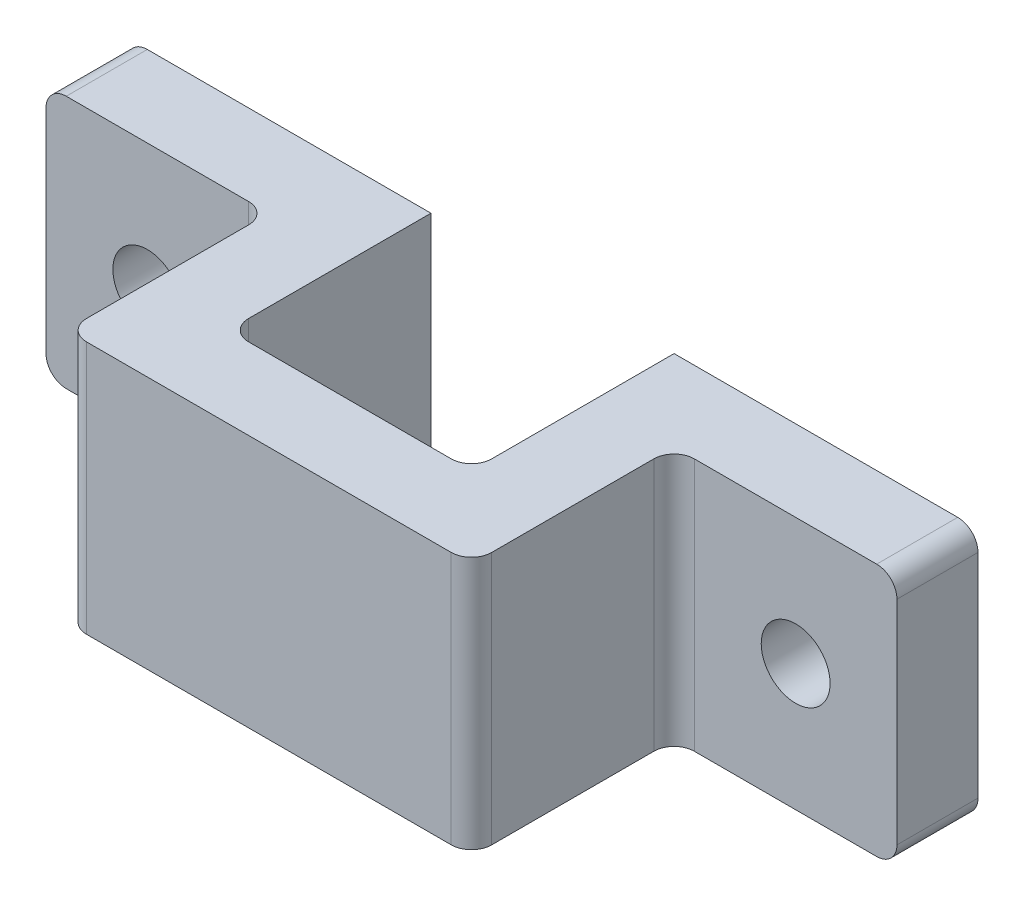
ISO-10303-21;
HEADER;
FILE_DESCRIPTION(('STEP AP214'),'2;1');
FILE_NAME('part.step','',(''),(''),'','','');
FILE_SCHEMA(('AUTOMOTIVE_DESIGN { 1 0 10303 214 1 1 1 1 }'));
ENDSEC;
DATA;
#1=APPLICATION_CONTEXT('core data for automotive mechanical design processes');
#2=APPLICATION_PROTOCOL_DEFINITION('international standard','automotive_design',2000,#1);
#3=PRODUCT_CONTEXT('',#1,'mechanical');
#4=PRODUCT('Part','Part','',(#3));
#5=PRODUCT_RELATED_PRODUCT_CATEGORY('part','',(#4));
#6=PRODUCT_DEFINITION_FORMATION('','',#4);
#7=PRODUCT_DEFINITION_CONTEXT('part definition',#1,'design');
#8=PRODUCT_DEFINITION('design','',#6,#7);
#9=PRODUCT_DEFINITION_SHAPE('','',#8);
#10=(LENGTH_UNIT() NAMED_UNIT(*) SI_UNIT(.MILLI.,.METRE.));
#11=(NAMED_UNIT(*) PLANE_ANGLE_UNIT() SI_UNIT($,.RADIAN.));
#12=(NAMED_UNIT(*) SI_UNIT($,.STERADIAN.) SOLID_ANGLE_UNIT());
#13=UNCERTAINTY_MEASURE_WITH_UNIT(LENGTH_MEASURE(1.E-05),#10,'distance_accuracy_value','');
#14=(GEOMETRIC_REPRESENTATION_CONTEXT(3) GLOBAL_UNCERTAINTY_ASSIGNED_CONTEXT((#13)) GLOBAL_UNIT_ASSIGNED_CONTEXT((#10,
#11,#12)) REPRESENTATION_CONTEXT('',''));
#15=CARTESIAN_POINT('',(0.,0.,0.));
#16=DIRECTION('',(0.,0.,1.));
#17=DIRECTION('',(1.,0.,0.));
#18=AXIS2_PLACEMENT_3D('',#15,#16,#17);
#19=CARTESIAN_POINT('',(0.,0.,0.));
#20=DIRECTION('',(0.,0.,1.));
#21=DIRECTION('',(1.,0.,0.));
#22=AXIS2_PLACEMENT_3D('',#19,#20,#21);
#23=PLANE('',#22);
#24=CARTESIAN_POINT('',(-20.,5.25,0.));
#25=DIRECTION('',(0.,0.,1.));
#26=DIRECTION('',(-0.707106781186548,0.707106781186548,0.));
#27=AXIS2_PLACEMENT_3D('',#24,#25,#26);
#28=CIRCLE('',#27,1.);
#29=CARTESIAN_POINT('',(-20.,6.25,0.));
#30=VERTEX_POINT('',#29);
#31=CARTESIAN_POINT('',(-21.,5.25,0.));
#32=VERTEX_POINT('',#31);
#33=EDGE_CURVE('E264',#30,#32,#28,.T.);
#34=ORIENTED_EDGE('',*,*,#33,.F.);
#35=DIRECTION('',(1.,0.,0.));
#36=VECTOR('',#35,1.);
#37=CARTESIAN_POINT('',(-21.,6.25,0.));
#38=LINE('',#37,#36);
#39=CARTESIAN_POINT('',(-6.,6.25,0.));
#40=VERTEX_POINT('',#39);
#41=EDGE_CURVE('E283',#30,#40,#38,.T.);
#42=ORIENTED_EDGE('',*,*,#41,.T.);
#43=DIRECTION('',(0.,-1.,0.));
#44=VECTOR('',#43,1.);
#45=CARTESIAN_POINT('',(-6.,-3.125,0.));
#46=LINE('',#45,#44);
#47=CARTESIAN_POINT('',(-6.,-6.25,0.));
#48=VERTEX_POINT('',#47);
#49=EDGE_CURVE('E431',#40,#48,#46,.T.);
#50=ORIENTED_EDGE('',*,*,#49,.T.);
#51=DIRECTION('',(-1.,0.,0.));
#52=VECTOR('',#51,1.);
#53=CARTESIAN_POINT('',(21.,-6.25,0.));
#54=LINE('',#53,#52);
#55=CARTESIAN_POINT('',(-20.,-6.25,0.));
#56=VERTEX_POINT('',#55);
#57=EDGE_CURVE('E402',#48,#56,#54,.T.);
#58=ORIENTED_EDGE('',*,*,#57,.T.);
#59=CARTESIAN_POINT('',(-20.,-5.25,0.));
#60=DIRECTION('',(0.,0.,1.));
#61=DIRECTION('',(-0.707106781186548,-0.707106781186548,0.));
#62=AXIS2_PLACEMENT_3D('',#59,#60,#61);
#63=CIRCLE('',#62,1.);
#64=CARTESIAN_POINT('',(-21.,-5.25,0.));
#65=VERTEX_POINT('',#64);
#66=EDGE_CURVE('E435',#65,#56,#63,.T.);
#67=ORIENTED_EDGE('',*,*,#66,.F.);
#68=DIRECTION('',(0.,1.,0.));
#69=VECTOR('',#68,1.);
#70=CARTESIAN_POINT('',(-21.,-6.25,0.));
#71=LINE('',#70,#69);
#72=EDGE_CURVE('E12',#65,#32,#71,.T.);
#73=ORIENTED_EDGE('',*,*,#72,.T.);
#74=EDGE_LOOP('',(#34,#42,#50,#58,#67,#73));
#75=FACE_BOUND('',#74,.T.);
#76=CARTESIAN_POINT('',(-16.,0.,0.));
#77=DIRECTION('',(0.,0.,1.));
#78=DIRECTION('',(1.,0.,0.));
#79=AXIS2_PLACEMENT_3D('',#76,#77,#78);
#80=CIRCLE('',#79,1.7);
#81=CARTESIAN_POINT('',(-14.3,0.,0.));
#82=VERTEX_POINT('',#81);
#83=EDGE_CURVE('E509',#82,#82,#80,.T.);
#84=ORIENTED_EDGE('',*,*,#83,.T.);
#85=EDGE_LOOP('',(#84));
#86=FACE_BOUND('',#85,.T.);
#87=ADVANCED_FACE('F57',(#75,#86),#23,.F.);
#88=CARTESIAN_POINT('',(-21.,6.25,0.));
#89=DIRECTION('',(-1.,0.,0.));
#90=DIRECTION('',(0.,0.,1.));
#91=AXIS2_PLACEMENT_3D('',#88,#89,#90);
#92=PLANE('',#91);
#93=DIRECTION('',(0.,0.,1.));
#94=VECTOR('',#93,1.);
#95=CARTESIAN_POINT('',(-21.,5.25,0.));
#96=LINE('',#95,#94);
#97=CARTESIAN_POINT('',(-21.,5.25,4.));
#98=VERTEX_POINT('',#97);
#99=EDGE_CURVE('E260',#32,#98,#96,.T.);
#100=ORIENTED_EDGE('',*,*,#99,.F.);
#101=ORIENTED_EDGE('',*,*,#72,.F.);
#102=DIRECTION('',(0.,0.,-1.));
#103=VECTOR('',#102,1.);
#104=CARTESIAN_POINT('',(-21.,-5.25,0.));
#105=LINE('',#104,#103);
#106=CARTESIAN_POINT('',(-21.,-5.25,4.));
#107=VERTEX_POINT('',#106);
#108=EDGE_CURVE('E81',#107,#65,#105,.T.);
#109=ORIENTED_EDGE('',*,*,#108,.F.);
#110=DIRECTION('',(0.,-1.,0.));
#111=VECTOR('',#110,1.);
#112=CARTESIAN_POINT('',(-21.,-6.25,4.));
#113=LINE('',#112,#111);
#114=EDGE_CURVE('E353',#98,#107,#113,.T.);
#115=ORIENTED_EDGE('',*,*,#114,.F.);
#116=EDGE_LOOP('',(#100,#101,#109,#115));
#117=FACE_BOUND('',#116,.T.);
#118=ADVANCED_FACE('F549',(#117),#92,.T.);
#119=CARTESIAN_POINT('',(21.,-6.25,0.));
#120=DIRECTION('',(1.,0.,0.));
#121=DIRECTION('',(0.,1.,0.));
#122=AXIS2_PLACEMENT_3D('',#119,#120,#121);
#123=PLANE('',#122);
#124=DIRECTION('',(0.,0.,-1.));
#125=VECTOR('',#124,1.);
#126=CARTESIAN_POINT('',(21.,5.25,0.));
#127=LINE('',#126,#125);
#128=CARTESIAN_POINT('',(21.,5.25,4.));
#129=VERTEX_POINT('',#128);
#130=CARTESIAN_POINT('',(21.,5.25,0.));
#131=VERTEX_POINT('',#130);
#132=EDGE_CURVE('E502',#129,#131,#127,.T.);
#133=ORIENTED_EDGE('',*,*,#132,.F.);
#134=DIRECTION('',(0.,1.,0.));
#135=VECTOR('',#134,1.);
#136=CARTESIAN_POINT('',(21.,6.25,4.));
#137=LINE('',#136,#135);
#138=CARTESIAN_POINT('',(21.,-5.25,4.));
#139=VERTEX_POINT('',#138);
#140=EDGE_CURVE('E65',#139,#129,#137,.T.);
#141=ORIENTED_EDGE('',*,*,#140,.F.);
#142=DIRECTION('',(0.,0.,1.));
#143=VECTOR('',#142,1.);
#144=CARTESIAN_POINT('',(21.,-5.25,0.));
#145=LINE('',#144,#143);
#146=CARTESIAN_POINT('',(21.,-5.25,0.));
#147=VERTEX_POINT('',#146);
#148=EDGE_CURVE('E354',#147,#139,#145,.T.);
#149=ORIENTED_EDGE('',*,*,#148,.F.);
#150=DIRECTION('',(0.,-1.,0.));
#151=VECTOR('',#150,1.);
#152=CARTESIAN_POINT('',(21.,6.25,0.));
#153=LINE('',#152,#151);
#154=EDGE_CURVE('E333',#131,#147,#153,.T.);
#155=ORIENTED_EDGE('',*,*,#154,.F.);
#156=EDGE_LOOP('',(#133,#141,#149,#155));
#157=FACE_BOUND('',#156,.T.);
#158=ADVANCED_FACE('F499',(#157),#123,.T.);
#159=CARTESIAN_POINT('',(0.,0.,4.));
#160=DIRECTION('',(0.,0.,1.));
#161=DIRECTION('',(1.,0.,0.));
#162=AXIS2_PLACEMENT_3D('',#159,#160,#161);
#163=PLANE('',#162);
#164=CARTESIAN_POINT('',(20.,5.25,4.));
#165=DIRECTION('',(0.,0.,-1.));
#166=DIRECTION('',(0.707106781186548,0.707106781186548,0.));
#167=AXIS2_PLACEMENT_3D('',#164,#165,#166);
#168=CIRCLE('',#167,1.);
#169=CARTESIAN_POINT('',(20.,6.25,4.));
#170=VERTEX_POINT('',#169);
#171=EDGE_CURVE('E504',#170,#129,#168,.T.);
#172=ORIENTED_EDGE('',*,*,#171,.F.);
#173=DIRECTION('',(-1.,0.,0.));
#174=VECTOR('',#173,1.);
#175=CARTESIAN_POINT('',(-21.,6.25,4.));
#176=LINE('',#175,#174);
#177=CARTESIAN_POINT('',(11.,6.25,4.));
#178=VERTEX_POINT('',#177);
#179=EDGE_CURVE('E329',#170,#178,#176,.T.);
#180=ORIENTED_EDGE('',*,*,#179,.T.);
#181=DIRECTION('',(0.,1.,0.));
#182=VECTOR('',#181,1.);
#183=CARTESIAN_POINT('',(11.,-3.125,4.));
#184=LINE('',#183,#182);
#185=CARTESIAN_POINT('',(11.,-6.25,4.));
#186=VERTEX_POINT('',#185);
#187=EDGE_CURVE('E293',#186,#178,#184,.T.);
#188=ORIENTED_EDGE('',*,*,#187,.F.);
#189=DIRECTION('',(1.,0.,0.));
#190=VECTOR('',#189,1.);
#191=CARTESIAN_POINT('',(21.,-6.25,4.));
#192=LINE('',#191,#190);
#193=CARTESIAN_POINT('',(20.,-6.25,4.));
#194=VERTEX_POINT('',#193);
#195=EDGE_CURVE('E358',#186,#194,#192,.T.);
#196=ORIENTED_EDGE('',*,*,#195,.T.);
#197=CARTESIAN_POINT('',(20.,-5.25,4.));
#198=DIRECTION('',(0.,0.,-1.));
#199=DIRECTION('',(0.707106781186548,-0.707106781186548,0.));
#200=AXIS2_PLACEMENT_3D('',#197,#198,#199);
#201=CIRCLE('',#200,1.);
#202=EDGE_CURVE('E345',#139,#194,#201,.T.);
#203=ORIENTED_EDGE('',*,*,#202,.F.);
#204=ORIENTED_EDGE('',*,*,#140,.T.);
#205=EDGE_LOOP('',(#172,#180,#188,#196,#203,#204));
#206=FACE_BOUND('',#205,.T.);
#207=CARTESIAN_POINT('',(16.0000003129244,0.,4.));
#208=DIRECTION('',(0.,0.,-1.));
#209=DIRECTION('',(-1.,0.,0.));
#210=AXIS2_PLACEMENT_3D('',#207,#208,#209);
#211=CIRCLE('',#210,1.7);
#212=CARTESIAN_POINT('',(14.3000003129244,0.,4.));
#213=VERTEX_POINT('',#212);
#214=EDGE_CURVE('E567',#213,#213,#211,.T.);
#215=ORIENTED_EDGE('',*,*,#214,.T.);
#216=EDGE_LOOP('',(#215));
#217=FACE_BOUND('',#216,.T.);
#218=ADVANCED_FACE('F486',(#206,#217),#163,.T.);
#219=CARTESIAN_POINT('',(-5.,-6.25,9.));
#220=DIRECTION('',(0.,1.,0.));
#221=DIRECTION('',(0.,0.,1.));
#222=AXIS2_PLACEMENT_3D('',#219,#220,#221);
#223=CYLINDRICAL_SURFACE('',#222,1.);
#224=CARTESIAN_POINT('',(-5.,6.25,9.));
#225=DIRECTION('',(0.,-1.,0.));
#226=DIRECTION('',(0.,0.,1.));
#227=AXIS2_PLACEMENT_3D('',#224,#225,#226);
#228=CIRCLE('',#227,1.);
#229=CARTESIAN_POINT('',(-5.,6.25,10.));
#230=VERTEX_POINT('',#229);
#231=CARTESIAN_POINT('',(-6.,6.25,9.));
#232=VERTEX_POINT('',#231);
#233=EDGE_CURVE('E466',#230,#232,#228,.T.);
#234=ORIENTED_EDGE('',*,*,#233,.F.);
#235=DIRECTION('',(0.,1.,0.));
#236=VECTOR('',#235,1.);
#237=CARTESIAN_POINT('',(-5.,-6.25,10.));
#238=LINE('',#237,#236);
#239=CARTESIAN_POINT('',(-5.,-6.25,10.));
#240=VERTEX_POINT('',#239);
#241=EDGE_CURVE('E299',#240,#230,#238,.T.);
#242=ORIENTED_EDGE('',*,*,#241,.F.);
#243=CARTESIAN_POINT('',(-5.,-6.25,9.));
#244=DIRECTION('',(0.,1.,0.));
#245=DIRECTION('',(0.,0.,1.));
#246=AXIS2_PLACEMENT_3D('',#243,#244,#245);
#247=CIRCLE('',#246,1.);
#248=CARTESIAN_POINT('',(-6.,-6.25,9.));
#249=VERTEX_POINT('',#248);
#250=EDGE_CURVE('E372',#249,#240,#247,.T.);
#251=ORIENTED_EDGE('',*,*,#250,.F.);
#252=DIRECTION('',(0.,1.,0.));
#253=VECTOR('',#252,1.);
#254=CARTESIAN_POINT('',(-6.,-6.25,9.));
#255=LINE('',#254,#253);
#256=EDGE_CURVE('E439',#249,#232,#255,.T.);
#257=ORIENTED_EDGE('',*,*,#256,.T.);
#258=EDGE_LOOP('',(#234,#242,#251,#257));
#259=FACE_BOUND('',#258,.T.);
#260=ADVANCED_FACE('F546',(#259),#223,.F.);
#261=CARTESIAN_POINT('',(-5.,-6.25,10.));
#262=DIRECTION('',(0.,0.,1.));
#263=DIRECTION('',(1.,0.,0.));
#264=AXIS2_PLACEMENT_3D('',#261,#262,#263);
#265=PLANE('',#264);
#266=DIRECTION('',(-1.,0.,0.));
#267=VECTOR('',#266,1.);
#268=CARTESIAN_POINT('',(8.,6.25,10.));
#269=LINE('',#268,#267);
#270=CARTESIAN_POINT('',(5.,6.25,10.));
#271=VERTEX_POINT('',#270);
#272=EDGE_CURVE('E462',#271,#230,#269,.T.);
#273=ORIENTED_EDGE('',*,*,#272,.F.);
#274=DIRECTION('',(0.,1.,0.));
#275=VECTOR('',#274,1.);
#276=CARTESIAN_POINT('',(5.,-6.25,10.));
#277=LINE('',#276,#275);
#278=CARTESIAN_POINT('',(5.,-6.25,10.));
#279=VERTEX_POINT('',#278);
#280=EDGE_CURVE('E430',#279,#271,#277,.T.);
#281=ORIENTED_EDGE('',*,*,#280,.F.);
#282=DIRECTION('',(1.,0.,0.));
#283=VECTOR('',#282,1.);
#284=CARTESIAN_POINT('',(-13.,-6.25,10.));
#285=LINE('',#284,#283);
#286=EDGE_CURVE('E376',#240,#279,#285,.T.);
#287=ORIENTED_EDGE('',*,*,#286,.F.);
#288=ORIENTED_EDGE('',*,*,#241,.T.);
#289=EDGE_LOOP('',(#273,#281,#287,#288));
#290=FACE_BOUND('',#289,.T.);
#291=ADVANCED_FACE('F537',(#290),#265,.F.);
#292=CARTESIAN_POINT('',(5.,-6.25,9.));
#293=DIRECTION('',(0.,1.,0.));
#294=DIRECTION('',(1.,0.,0.));
#295=AXIS2_PLACEMENT_3D('',#292,#293,#294);
#296=CYLINDRICAL_SURFACE('',#295,1.);
#297=CARTESIAN_POINT('',(5.,6.25,9.));
#298=DIRECTION('',(0.,-1.,0.));
#299=DIRECTION('',(1.,0.,0.));
#300=AXIS2_PLACEMENT_3D('',#297,#298,#299);
#301=CIRCLE('',#300,1.);
#302=CARTESIAN_POINT('',(6.,6.25,9.));
#303=VERTEX_POINT('',#302);
#304=EDGE_CURVE('E467',#303,#271,#301,.T.);
#305=ORIENTED_EDGE('',*,*,#304,.F.);
#306=DIRECTION('',(0.,1.,0.));
#307=VECTOR('',#306,1.);
#308=CARTESIAN_POINT('',(6.,-6.25,9.));
#309=LINE('',#308,#307);
#310=CARTESIAN_POINT('',(6.,-6.25,9.));
#311=VERTEX_POINT('',#310);
#312=EDGE_CURVE('E428',#311,#303,#309,.T.);
#313=ORIENTED_EDGE('',*,*,#312,.F.);
#314=CARTESIAN_POINT('',(5.,-6.25,9.));
#315=DIRECTION('',(0.,1.,0.));
#316=DIRECTION('',(1.,0.,0.));
#317=AXIS2_PLACEMENT_3D('',#314,#315,#316);
#318=CIRCLE('',#317,1.);
#319=EDGE_CURVE('E412',#279,#311,#318,.T.);
#320=ORIENTED_EDGE('',*,*,#319,.F.);
#321=ORIENTED_EDGE('',*,*,#280,.T.);
#322=EDGE_LOOP('',(#305,#313,#320,#321));
#323=FACE_BOUND('',#322,.T.);
#324=ADVANCED_FACE('F535',(#323),#296,.F.);
#325=CARTESIAN_POINT('',(6.,-6.25,9.));
#326=DIRECTION('',(1.,0.,0.));
#327=DIRECTION('',(0.,1.,0.));
#328=AXIS2_PLACEMENT_3D('',#325,#326,#327);
#329=PLANE('',#328);
#330=DIRECTION('',(0.,0.,1.));
#331=VECTOR('',#330,1.);
#332=CARTESIAN_POINT('',(6.,6.25,4.5));
#333=LINE('',#332,#331);
#334=CARTESIAN_POINT('',(6.,6.25,0.));
#335=VERTEX_POINT('',#334);
#336=EDGE_CURVE('E471',#335,#303,#333,.T.);
#337=ORIENTED_EDGE('',*,*,#336,.F.);
#338=DIRECTION('',(0.,1.,0.));
#339=VECTOR('',#338,1.);
#340=CARTESIAN_POINT('',(6.,-3.125,0.));
#341=LINE('',#340,#339);
#342=CARTESIAN_POINT('',(6.,-6.25,0.));
#343=VERTEX_POINT('',#342);
#344=EDGE_CURVE('E304',#343,#335,#341,.T.);
#345=ORIENTED_EDGE('',*,*,#344,.F.);
#346=DIRECTION('',(0.,0.,-1.));
#347=VECTOR('',#346,1.);
#348=CARTESIAN_POINT('',(6.,-6.25,4.5));
#349=LINE('',#348,#347);
#350=EDGE_CURVE('E413',#311,#343,#349,.T.);
#351=ORIENTED_EDGE('',*,*,#350,.F.);
#352=ORIENTED_EDGE('',*,*,#312,.T.);
#353=EDGE_LOOP('',(#337,#345,#351,#352));
#354=FACE_BOUND('',#353,.T.);
#355=ADVANCED_FACE('F532',(#354),#329,.F.);
#356=CARTESIAN_POINT('',(-6.,-6.25,0.));
#357=DIRECTION('',(-1.,0.,0.));
#358=DIRECTION('',(0.,0.,1.));
#359=AXIS2_PLACEMENT_3D('',#356,#357,#358);
#360=PLANE('',#359);
#361=DIRECTION('',(0.,0.,-1.));
#362=VECTOR('',#361,1.);
#363=CARTESIAN_POINT('',(-6.,6.25,0.));
#364=LINE('',#363,#362);
#365=EDGE_CURVE('E289',#232,#40,#364,.T.);
#366=ORIENTED_EDGE('',*,*,#365,.F.);
#367=ORIENTED_EDGE('',*,*,#256,.F.);
#368=DIRECTION('',(0.,0.,1.));
#369=VECTOR('',#368,1.);
#370=CARTESIAN_POINT('',(-6.,-6.25,0.));
#371=LINE('',#370,#369);
#372=EDGE_CURVE('E377',#48,#249,#371,.T.);
#373=ORIENTED_EDGE('',*,*,#372,.F.);
#374=ORIENTED_EDGE('',*,*,#49,.F.);
#375=EDGE_LOOP('',(#366,#367,#373,#374));
#376=FACE_BOUND('',#375,.T.);
#377=ADVANCED_FACE('F544',(#376),#360,.F.);
#378=CARTESIAN_POINT('',(0.,0.,14.));
#379=DIRECTION('',(0.,0.,1.));
#380=DIRECTION('',(1.,0.,0.));
#381=AXIS2_PLACEMENT_3D('',#378,#379,#380);
#382=PLANE('',#381);
#383=DIRECTION('',(0.,-1.,0.));
#384=VECTOR('',#383,1.);
#385=CARTESIAN_POINT('',(9.,-3.125,14.));
#386=LINE('',#385,#384);
#387=CARTESIAN_POINT('',(9.,6.25,14.));
#388=VERTEX_POINT('',#387);
#389=CARTESIAN_POINT('',(9.,-6.25,14.));
#390=VERTEX_POINT('',#389);
#391=EDGE_CURVE('E420',#388,#390,#386,.T.);
#392=ORIENTED_EDGE('',*,*,#391,.F.);
#393=DIRECTION('',(-1.,0.,0.));
#394=VECTOR('',#393,1.);
#395=CARTESIAN_POINT('',(-10.,6.25,14.));
#396=LINE('',#395,#394);
#397=CARTESIAN_POINT('',(-9.,6.25,14.));
#398=VERTEX_POINT('',#397);
#399=EDGE_CURVE('E322',#388,#398,#396,.T.);
#400=ORIENTED_EDGE('',*,*,#399,.T.);
#401=DIRECTION('',(0.,1.,0.));
#402=VECTOR('',#401,1.);
#403=CARTESIAN_POINT('',(-9.,3.125,14.));
#404=LINE('',#403,#402);
#405=CARTESIAN_POINT('',(-9.,-6.25,14.));
#406=VERTEX_POINT('',#405);
#407=EDGE_CURVE('E438',#406,#398,#404,.T.);
#408=ORIENTED_EDGE('',*,*,#407,.F.);
#409=DIRECTION('',(1.,0.,0.));
#410=VECTOR('',#409,1.);
#411=CARTESIAN_POINT('',(10.,-6.25,14.));
#412=LINE('',#411,#410);
#413=EDGE_CURVE('E371',#406,#390,#412,.T.);
#414=ORIENTED_EDGE('',*,*,#413,.T.);
#415=EDGE_LOOP('',(#392,#400,#408,#414));
#416=FACE_BOUND('',#415,.T.);
#417=ADVANCED_FACE('F602',(#416),#382,.T.);
#418=CARTESIAN_POINT('',(-9.,3.125,13.));
#419=DIRECTION('',(0.,-1.,0.));
#420=DIRECTION('',(-0.707106781186548,0.,0.707106781186548));
#421=AXIS2_PLACEMENT_3D('',#418,#419,#420);
#422=CYLINDRICAL_SURFACE('',#421,1.);
#423=CARTESIAN_POINT('',(-9.,-6.25,13.));
#424=DIRECTION('',(0.,1.,0.));
#425=DIRECTION('',(-0.707106781186548,0.,0.707106781186548));
#426=AXIS2_PLACEMENT_3D('',#423,#424,#425);
#427=CIRCLE('',#426,1.);
#428=CARTESIAN_POINT('',(-10.,-6.25,13.));
#429=VERTEX_POINT('',#428);
#430=EDGE_CURVE('E381',#429,#406,#427,.T.);
#431=ORIENTED_EDGE('',*,*,#430,.T.);
#432=ORIENTED_EDGE('',*,*,#407,.T.);
#433=CARTESIAN_POINT('',(-9.,6.25,13.));
#434=DIRECTION('',(0.,-1.,0.));
#435=DIRECTION('',(-0.707106781186548,0.,0.707106781186548));
#436=AXIS2_PLACEMENT_3D('',#433,#434,#435);
#437=CIRCLE('',#436,1.);
#438=CARTESIAN_POINT('',(-10.,6.25,13.));
#439=VERTEX_POINT('',#438);
#440=EDGE_CURVE('E318',#398,#439,#437,.T.);
#441=ORIENTED_EDGE('',*,*,#440,.T.);
#442=DIRECTION('',(0.,-1.,0.));
#443=VECTOR('',#442,1.);
#444=CARTESIAN_POINT('',(-10.,3.125,13.));
#445=LINE('',#444,#443);
#446=EDGE_CURVE('E265',#439,#429,#445,.T.);
#447=ORIENTED_EDGE('',*,*,#446,.T.);
#448=EDGE_LOOP('',(#431,#432,#441,#447));
#449=FACE_BOUND('',#448,.T.);
#450=ADVANCED_FACE('F599',(#449),#422,.T.);
#451=CARTESIAN_POINT('',(-20.,-5.25,0.));
#452=DIRECTION('',(0.,0.,1.));
#453=DIRECTION('',(-0.707106781186548,-0.707106781186548,0.));
#454=AXIS2_PLACEMENT_3D('',#451,#452,#453);
#455=CYLINDRICAL_SURFACE('',#454,1.);
#456=CARTESIAN_POINT('',(-20.,-5.25,4.));
#457=DIRECTION('',(0.,0.,-1.));
#458=DIRECTION('',(-0.707106781186548,-0.707106781186548,0.));
#459=AXIS2_PLACEMENT_3D('',#456,#457,#458);
#460=CIRCLE('',#459,1.);
#461=CARTESIAN_POINT('',(-20.,-6.25,4.));
#462=VERTEX_POINT('',#461);
#463=EDGE_CURVE('E350',#462,#107,#460,.T.);
#464=ORIENTED_EDGE('',*,*,#463,.T.);
#465=ORIENTED_EDGE('',*,*,#108,.T.);
#466=ORIENTED_EDGE('',*,*,#66,.T.);
#467=DIRECTION('',(0.,0.,1.));
#468=VECTOR('',#467,1.);
#469=CARTESIAN_POINT('',(-20.,-6.25,0.));
#470=LINE('',#469,#468);
#471=EDGE_CURVE('E396',#56,#462,#470,.T.);
#472=ORIENTED_EDGE('',*,*,#471,.T.);
#473=EDGE_LOOP('',(#464,#465,#466,#472));
#474=FACE_BOUND('',#473,.T.);
#475=ADVANCED_FACE('F588',(#474),#455,.T.);
#476=CARTESIAN_POINT('',(0.,0.,4.));
#477=DIRECTION('',(0.,0.,1.));
#478=DIRECTION('',(1.,0.,0.));
#479=AXIS2_PLACEMENT_3D('',#476,#477,#478);
#480=PLANE('',#479);
#481=DIRECTION('',(0.,-1.,0.));
#482=VECTOR('',#481,1.);
#483=CARTESIAN_POINT('',(-11.,3.125,4.));
#484=LINE('',#483,#482);
#485=CARTESIAN_POINT('',(-11.,6.25,4.));
#486=VERTEX_POINT('',#485);
#487=CARTESIAN_POINT('',(-11.,-6.25,4.));
#488=VERTEX_POINT('',#487);
#489=EDGE_CURVE('E272',#486,#488,#484,.T.);
#490=ORIENTED_EDGE('',*,*,#489,.F.);
#491=DIRECTION('',(-1.,0.,0.));
#492=VECTOR('',#491,1.);
#493=CARTESIAN_POINT('',(-21.,6.25,4.));
#494=LINE('',#493,#492);
#495=CARTESIAN_POINT('',(-20.,6.25,4.));
#496=VERTEX_POINT('',#495);
#497=EDGE_CURVE('E268',#486,#496,#494,.T.);
#498=ORIENTED_EDGE('',*,*,#497,.T.);
#499=CARTESIAN_POINT('',(-20.,5.25,4.));
#500=DIRECTION('',(0.,0.,-1.));
#501=DIRECTION('',(-0.707106781186548,0.707106781186548,0.));
#502=AXIS2_PLACEMENT_3D('',#499,#500,#501);
#503=CIRCLE('',#502,1.);
#504=EDGE_CURVE('E253',#98,#496,#503,.T.);
#505=ORIENTED_EDGE('',*,*,#504,.F.);
#506=ORIENTED_EDGE('',*,*,#114,.T.);
#507=ORIENTED_EDGE('',*,*,#463,.F.);
#508=DIRECTION('',(1.,0.,0.));
#509=VECTOR('',#508,1.);
#510=CARTESIAN_POINT('',(21.,-6.25,4.));
#511=LINE('',#510,#509);
#512=EDGE_CURVE('E393',#462,#488,#511,.T.);
#513=ORIENTED_EDGE('',*,*,#512,.T.);
#514=EDGE_LOOP('',(#490,#498,#505,#506,#507,#513));
#515=FACE_BOUND('',#514,.T.);
#516=CARTESIAN_POINT('',(-16.,0.,4.));
#517=DIRECTION('',(0.,0.,1.));
#518=DIRECTION('',(1.,0.,0.));
#519=AXIS2_PLACEMENT_3D('',#516,#517,#518);
#520=CIRCLE('',#519,1.7);
#521=CARTESIAN_POINT('',(-14.3,0.,4.));
#522=VERTEX_POINT('',#521);
#523=EDGE_CURVE('E517',#522,#522,#520,.T.);
#524=ORIENTED_EDGE('',*,*,#523,.F.);
#525=EDGE_LOOP('',(#524));
#526=FACE_BOUND('',#525,.T.);
#527=ADVANCED_FACE('F269',(#515,#526),#480,.T.);
#528=CARTESIAN_POINT('',(-20.,5.25,0.));
#529=DIRECTION('',(0.,0.,1.));
#530=DIRECTION('',(-0.707106781186548,0.707106781186548,0.));
#531=AXIS2_PLACEMENT_3D('',#528,#529,#530);
#532=CYLINDRICAL_SURFACE('',#531,1.);
#533=ORIENTED_EDGE('',*,*,#504,.T.);
#534=DIRECTION('',(0.,0.,-1.));
#535=VECTOR('',#534,1.);
#536=CARTESIAN_POINT('',(-20.,6.25,0.));
#537=LINE('',#536,#535);
#538=EDGE_CURVE('E258',#496,#30,#537,.T.);
#539=ORIENTED_EDGE('',*,*,#538,.T.);
#540=ORIENTED_EDGE('',*,*,#33,.T.);
#541=ORIENTED_EDGE('',*,*,#99,.T.);
#542=EDGE_LOOP('',(#533,#539,#540,#541));
#543=FACE_BOUND('',#542,.T.);
#544=ADVANCED_FACE('F255',(#543),#532,.T.);
#545=CARTESIAN_POINT('',(-10.,6.25,4.));
#546=DIRECTION('',(-1.,0.,0.));
#547=DIRECTION('',(0.,0.,1.));
#548=AXIS2_PLACEMENT_3D('',#545,#546,#547);
#549=PLANE('',#548);
#550=DIRECTION('',(0.,1.,0.));
#551=VECTOR('',#550,1.);
#552=CARTESIAN_POINT('',(-10.,3.125,5.));
#553=LINE('',#552,#551);
#554=CARTESIAN_POINT('',(-10.,-6.25,5.));
#555=VERTEX_POINT('',#554);
#556=CARTESIAN_POINT('',(-10.,6.25,5.));
#557=VERTEX_POINT('',#556);
#558=EDGE_CURVE('E423',#555,#557,#553,.T.);
#559=ORIENTED_EDGE('',*,*,#558,.F.);
#560=DIRECTION('',(0.,0.,1.));
#561=VECTOR('',#560,1.);
#562=CARTESIAN_POINT('',(-10.,-6.25,4.));
#563=LINE('',#562,#561);
#564=EDGE_CURVE('E385',#555,#429,#563,.T.);
#565=ORIENTED_EDGE('',*,*,#564,.T.);
#566=ORIENTED_EDGE('',*,*,#446,.F.);
#567=DIRECTION('',(0.,0.,1.));
#568=VECTOR('',#567,1.);
#569=CARTESIAN_POINT('',(-10.,6.25,4.));
#570=LINE('',#569,#568);
#571=EDGE_CURVE('E308',#557,#439,#570,.T.);
#572=ORIENTED_EDGE('',*,*,#571,.F.);
#573=EDGE_LOOP('',(#559,#565,#566,#572));
#574=FACE_BOUND('',#573,.T.);
#575=ADVANCED_FACE('F597',(#574),#549,.T.);
#576=CARTESIAN_POINT('',(-11.,3.125,5.));
#577=DIRECTION('',(0.,1.,0.));
#578=DIRECTION('',(0.707106781186548,0.,-0.707106781186547));
#579=AXIS2_PLACEMENT_3D('',#576,#577,#578);
#580=CYLINDRICAL_SURFACE('',#579,1.);
#581=CARTESIAN_POINT('',(-11.,-6.25,5.));
#582=DIRECTION('',(0.,-1.,0.));
#583=DIRECTION('',(0.707106781186548,0.,-0.707106781186547));
#584=AXIS2_PLACEMENT_3D('',#581,#582,#583);
#585=CIRCLE('',#584,1.);
#586=EDGE_CURVE('E389',#488,#555,#585,.T.);
#587=ORIENTED_EDGE('',*,*,#586,.T.);
#588=ORIENTED_EDGE('',*,*,#558,.T.);
#589=CARTESIAN_POINT('',(-11.,6.25,5.));
#590=DIRECTION('',(0.,1.,0.));
#591=DIRECTION('',(0.707106781186548,0.,-0.707106781186547));
#592=AXIS2_PLACEMENT_3D('',#589,#590,#591);
#593=CIRCLE('',#592,1.);
#594=EDGE_CURVE('E277',#557,#486,#593,.T.);
#595=ORIENTED_EDGE('',*,*,#594,.T.);
#596=ORIENTED_EDGE('',*,*,#489,.T.);
#597=EDGE_LOOP('',(#587,#588,#595,#596));
#598=FACE_BOUND('',#597,.T.);
#599=ADVANCED_FACE('F592',(#598),#580,.F.);
#600=CARTESIAN_POINT('',(9.,-3.125,13.));
#601=DIRECTION('',(0.,1.,0.));
#602=DIRECTION('',(0.707106781186548,0.,0.707106781186548));
#603=AXIS2_PLACEMENT_3D('',#600,#601,#602);
#604=CYLINDRICAL_SURFACE('',#603,1.);
#605=CARTESIAN_POINT('',(9.,6.25,13.));
#606=DIRECTION('',(0.,-1.,0.));
#607=DIRECTION('',(0.707106781186548,0.,0.707106781186548));
#608=AXIS2_PLACEMENT_3D('',#605,#606,#607);
#609=CIRCLE('',#608,1.);
#610=CARTESIAN_POINT('',(10.,6.25,13.));
#611=VERTEX_POINT('',#610);
#612=EDGE_CURVE('E314',#611,#388,#609,.T.);
#613=ORIENTED_EDGE('',*,*,#612,.T.);
#614=ORIENTED_EDGE('',*,*,#391,.T.);
#615=CARTESIAN_POINT('',(9.,-6.25,13.));
#616=DIRECTION('',(0.,1.,0.));
#617=DIRECTION('',(0.707106781186548,0.,0.707106781186548));
#618=AXIS2_PLACEMENT_3D('',#615,#616,#617);
#619=CIRCLE('',#618,1.);
#620=CARTESIAN_POINT('',(10.,-6.25,13.));
#621=VERTEX_POINT('',#620);
#622=EDGE_CURVE('E367',#390,#621,#619,.T.);
#623=ORIENTED_EDGE('',*,*,#622,.T.);
#624=DIRECTION('',(0.,1.,0.));
#625=VECTOR('',#624,1.);
#626=CARTESIAN_POINT('',(10.,-3.125,13.));
#627=LINE('',#626,#625);
#628=EDGE_CURVE('E294',#621,#611,#627,.T.);
#629=ORIENTED_EDGE('',*,*,#628,.T.);
#630=EDGE_LOOP('',(#613,#614,#623,#629));
#631=FACE_BOUND('',#630,.T.);
#632=ADVANCED_FACE('F606',(#631),#604,.T.);
#633=CARTESIAN_POINT('',(10.,-6.25,4.));
#634=DIRECTION('',(1.,0.,0.));
#635=DIRECTION('',(0.,1.,0.));
#636=AXIS2_PLACEMENT_3D('',#633,#634,#635);
#637=PLANE('',#636);
#638=DIRECTION('',(0.,-1.,0.));
#639=VECTOR('',#638,1.);
#640=CARTESIAN_POINT('',(10.,-3.125,5.));
#641=LINE('',#640,#639);
#642=CARTESIAN_POINT('',(10.,6.25,5.));
#643=VERTEX_POINT('',#642);
#644=CARTESIAN_POINT('',(10.,-6.25,5.));
#645=VERTEX_POINT('',#644);
#646=EDGE_CURVE('E295',#643,#645,#641,.T.);
#647=ORIENTED_EDGE('',*,*,#646,.F.);
#648=DIRECTION('',(0.,0.,1.));
#649=VECTOR('',#648,1.);
#650=CARTESIAN_POINT('',(10.,6.25,4.));
#651=LINE('',#650,#649);
#652=EDGE_CURVE('E309',#643,#611,#651,.T.);
#653=ORIENTED_EDGE('',*,*,#652,.T.);
#654=ORIENTED_EDGE('',*,*,#628,.F.);
#655=DIRECTION('',(0.,0.,1.));
#656=VECTOR('',#655,1.);
#657=CARTESIAN_POINT('',(10.,-6.25,4.));
#658=LINE('',#657,#656);
#659=EDGE_CURVE('E363',#645,#621,#658,.T.);
#660=ORIENTED_EDGE('',*,*,#659,.F.);
#661=EDGE_LOOP('',(#647,#653,#654,#660));
#662=FACE_BOUND('',#661,.T.);
#663=ADVANCED_FACE('F610',(#662),#637,.T.);
#664=CARTESIAN_POINT('',(11.,-3.125,5.));
#665=DIRECTION('',(0.,-1.,0.));
#666=DIRECTION('',(-0.707106781186548,0.,-0.707106781186547));
#667=AXIS2_PLACEMENT_3D('',#664,#665,#666);
#668=CYLINDRICAL_SURFACE('',#667,1.);
#669=CARTESIAN_POINT('',(11.,6.25,5.));
#670=DIRECTION('',(0.,1.,0.));
#671=DIRECTION('',(-0.707106781186548,0.,-0.707106781186547));
#672=AXIS2_PLACEMENT_3D('',#669,#670,#671);
#673=CIRCLE('',#672,1.);
#674=EDGE_CURVE('E313',#178,#643,#673,.T.);
#675=ORIENTED_EDGE('',*,*,#674,.T.);
#676=ORIENTED_EDGE('',*,*,#646,.T.);
#677=CARTESIAN_POINT('',(11.,-6.25,5.));
#678=DIRECTION('',(0.,-1.,0.));
#679=DIRECTION('',(-0.707106781186548,0.,-0.707106781186547));
#680=AXIS2_PLACEMENT_3D('',#677,#678,#679);
#681=CIRCLE('',#680,1.);
#682=EDGE_CURVE('E359',#645,#186,#681,.T.);
#683=ORIENTED_EDGE('',*,*,#682,.T.);
#684=ORIENTED_EDGE('',*,*,#187,.T.);
#685=EDGE_LOOP('',(#675,#676,#683,#684));
#686=FACE_BOUND('',#685,.T.);
#687=ADVANCED_FACE('F612',(#686),#668,.F.);
#688=CARTESIAN_POINT('',(-21.,-6.25,0.));
#689=DIRECTION('',(0.,-1.,0.));
#690=DIRECTION('',(0.,0.,-1.));
#691=AXIS2_PLACEMENT_3D('',#688,#689,#690);
#692=PLANE('',#691);
#693=DIRECTION('',(0.,0.,-1.));
#694=VECTOR('',#693,1.);
#695=CARTESIAN_POINT('',(20.,-6.25,0.));
#696=LINE('',#695,#694);
#697=CARTESIAN_POINT('',(20.,-6.25,0.));
#698=VERTEX_POINT('',#697);
#699=EDGE_CURVE('E349',#194,#698,#696,.T.);
#700=ORIENTED_EDGE('',*,*,#699,.F.);
#701=ORIENTED_EDGE('',*,*,#195,.F.);
#702=ORIENTED_EDGE('',*,*,#682,.F.);
#703=ORIENTED_EDGE('',*,*,#659,.T.);
#704=ORIENTED_EDGE('',*,*,#622,.F.);
#705=ORIENTED_EDGE('',*,*,#413,.F.);
#706=ORIENTED_EDGE('',*,*,#430,.F.);
#707=ORIENTED_EDGE('',*,*,#564,.F.);
#708=ORIENTED_EDGE('',*,*,#586,.F.);
#709=ORIENTED_EDGE('',*,*,#512,.F.);
#710=ORIENTED_EDGE('',*,*,#471,.F.);
#711=ORIENTED_EDGE('',*,*,#57,.F.);
#712=ORIENTED_EDGE('',*,*,#372,.T.);
#713=ORIENTED_EDGE('',*,*,#250,.T.);
#714=ORIENTED_EDGE('',*,*,#286,.T.);
#715=ORIENTED_EDGE('',*,*,#319,.T.);
#716=ORIENTED_EDGE('',*,*,#350,.T.);
#717=DIRECTION('',(-1.,0.,0.));
#718=VECTOR('',#717,1.);
#719=CARTESIAN_POINT('',(21.,-6.25,0.));
#720=LINE('',#719,#718);
#721=EDGE_CURVE('E300',#698,#343,#720,.T.);
#722=ORIENTED_EDGE('',*,*,#721,.F.);
#723=EDGE_LOOP('',(#700,#701,#702,#703,#704,#705,#706,#707,#708,#709,#710,#711,#712,#713,#714,
#715,#716,#722));
#724=FACE_BOUND('',#723,.T.);
#725=ADVANCED_FACE('F491',(#724),#692,.T.);
#726=CARTESIAN_POINT('',(20.,-5.25,0.));
#727=DIRECTION('',(0.,0.,1.));
#728=DIRECTION('',(0.707106781186548,-0.707106781186548,0.));
#729=AXIS2_PLACEMENT_3D('',#726,#727,#728);
#730=CYLINDRICAL_SURFACE('',#729,1.);
#731=ORIENTED_EDGE('',*,*,#202,.T.);
#732=ORIENTED_EDGE('',*,*,#699,.T.);
#733=CARTESIAN_POINT('',(20.,-5.25,0.));
#734=DIRECTION('',(0.,0.,1.));
#735=DIRECTION('',(0.707106781186548,-0.707106781186548,0.));
#736=AXIS2_PLACEMENT_3D('',#733,#734,#735);
#737=CIRCLE('',#736,1.);
#738=EDGE_CURVE('E305',#698,#147,#737,.T.);
#739=ORIENTED_EDGE('',*,*,#738,.T.);
#740=ORIENTED_EDGE('',*,*,#148,.T.);
#741=EDGE_LOOP('',(#731,#732,#739,#740));
#742=FACE_BOUND('',#741,.T.);
#743=ADVANCED_FACE('F496',(#742),#730,.T.);
#744=CARTESIAN_POINT('',(0.,0.,0.));
#745=DIRECTION('',(0.,0.,1.));
#746=DIRECTION('',(1.,0.,0.));
#747=AXIS2_PLACEMENT_3D('',#744,#745,#746);
#748=PLANE('',#747);
#749=CARTESIAN_POINT('',(20.,5.25,0.));
#750=DIRECTION('',(0.,0.,1.));
#751=DIRECTION('',(0.707106781186548,0.707106781186548,0.));
#752=AXIS2_PLACEMENT_3D('',#749,#750,#751);
#753=CIRCLE('',#752,1.);
#754=CARTESIAN_POINT('',(20.,6.25,0.));
#755=VERTEX_POINT('',#754);
#756=EDGE_CURVE('E514',#131,#755,#753,.T.);
#757=ORIENTED_EDGE('',*,*,#756,.F.);
#758=ORIENTED_EDGE('',*,*,#154,.T.);
#759=ORIENTED_EDGE('',*,*,#738,.F.);
#760=ORIENTED_EDGE('',*,*,#721,.T.);
#761=ORIENTED_EDGE('',*,*,#344,.T.);
#762=DIRECTION('',(1.,0.,0.));
#763=VECTOR('',#762,1.);
#764=CARTESIAN_POINT('',(-21.,6.25,0.));
#765=LINE('',#764,#763);
#766=EDGE_CURVE('E468',#335,#755,#765,.T.);
#767=ORIENTED_EDGE('',*,*,#766,.T.);
#768=EDGE_LOOP('',(#757,#758,#759,#760,#761,#767));
#769=FACE_BOUND('',#768,.T.);
#770=CARTESIAN_POINT('',(16.0000003129244,0.,0.));
#771=DIRECTION('',(0.,0.,-1.));
#772=DIRECTION('',(-1.,0.,0.));
#773=AXIS2_PLACEMENT_3D('',#770,#771,#772);
#774=CIRCLE('',#773,1.7);
#775=CARTESIAN_POINT('',(14.3000003129244,0.,0.));
#776=VERTEX_POINT('',#775);
#777=EDGE_CURVE('E570',#776,#776,#774,.T.);
#778=ORIENTED_EDGE('',*,*,#777,.F.);
#779=EDGE_LOOP('',(#778));
#780=FACE_BOUND('',#779,.T.);
#781=ADVANCED_FACE('F615',(#769,#780),#748,.F.);
#782=CARTESIAN_POINT('',(21.,6.25,0.));
#783=DIRECTION('',(0.,1.,0.));
#784=DIRECTION('',(1.,0.,0.));
#785=AXIS2_PLACEMENT_3D('',#782,#783,#784);
#786=PLANE('',#785);
#787=DIRECTION('',(0.,0.,1.));
#788=VECTOR('',#787,1.);
#789=CARTESIAN_POINT('',(20.,6.25,0.));
#790=LINE('',#789,#788);
#791=EDGE_CURVE('E459',#755,#170,#790,.T.);
#792=ORIENTED_EDGE('',*,*,#791,.F.);
#793=ORIENTED_EDGE('',*,*,#766,.F.);
#794=ORIENTED_EDGE('',*,*,#336,.T.);
#795=ORIENTED_EDGE('',*,*,#304,.T.);
#796=ORIENTED_EDGE('',*,*,#272,.T.);
#797=ORIENTED_EDGE('',*,*,#233,.T.);
#798=ORIENTED_EDGE('',*,*,#365,.T.);
#799=ORIENTED_EDGE('',*,*,#41,.F.);
#800=ORIENTED_EDGE('',*,*,#538,.F.);
#801=ORIENTED_EDGE('',*,*,#497,.F.);
#802=ORIENTED_EDGE('',*,*,#594,.F.);
#803=ORIENTED_EDGE('',*,*,#571,.T.);
#804=ORIENTED_EDGE('',*,*,#440,.F.);
#805=ORIENTED_EDGE('',*,*,#399,.F.);
#806=ORIENTED_EDGE('',*,*,#612,.F.);
#807=ORIENTED_EDGE('',*,*,#652,.F.);
#808=ORIENTED_EDGE('',*,*,#674,.F.);
#809=ORIENTED_EDGE('',*,*,#179,.F.);
#810=EDGE_LOOP('',(#792,#793,#794,#795,#796,#797,#798,#799,#800,#801,#802,#803,#804,#805,#806,
#807,#808,#809));
#811=FACE_BOUND('',#810,.T.);
#812=ADVANCED_FACE('F280',(#811),#786,.T.);
#813=CARTESIAN_POINT('',(20.,5.25,0.));
#814=DIRECTION('',(0.,0.,1.));
#815=DIRECTION('',(0.707106781186548,0.707106781186548,0.));
#816=AXIS2_PLACEMENT_3D('',#813,#814,#815);
#817=CYLINDRICAL_SURFACE('',#816,1.);
#818=ORIENTED_EDGE('',*,*,#171,.T.);
#819=ORIENTED_EDGE('',*,*,#132,.T.);
#820=ORIENTED_EDGE('',*,*,#756,.T.);
#821=ORIENTED_EDGE('',*,*,#791,.T.);
#822=EDGE_LOOP('',(#818,#819,#820,#821));
#823=FACE_BOUND('',#822,.T.);
#824=ADVANCED_FACE('F563',(#823),#817,.T.);
#825=CARTESIAN_POINT('',(-16.,0.,0.));
#826=DIRECTION('',(0.,0.,1.));
#827=DIRECTION('',(1.,0.,0.));
#828=AXIS2_PLACEMENT_3D('',#825,#826,#827);
#829=CYLINDRICAL_SURFACE('',#828,1.7);
#830=ORIENTED_EDGE('',*,*,#83,.F.);
#831=EDGE_LOOP('',(#830));
#832=FACE_BOUND('',#831,.T.);
#833=ORIENTED_EDGE('',*,*,#523,.T.);
#834=EDGE_LOOP('',(#833));
#835=FACE_BOUND('',#834,.T.);
#836=ADVANCED_FACE('F559',(#832,#835),#829,.F.);
#837=CARTESIAN_POINT('',(16.0000003129244,0.,0.));
#838=DIRECTION('',(0.,0.,1.));
#839=DIRECTION('',(1.,0.,0.));
#840=AXIS2_PLACEMENT_3D('',#837,#838,#839);
#841=CYLINDRICAL_SURFACE('',#840,1.7);
#842=ORIENTED_EDGE('',*,*,#777,.T.);
#843=EDGE_LOOP('',(#842));
#844=FACE_BOUND('',#843,.T.);
#845=ORIENTED_EDGE('',*,*,#214,.F.);
#846=EDGE_LOOP('',(#845));
#847=FACE_BOUND('',#846,.T.);
#848=ADVANCED_FACE('F562',(#844,#847),#841,.F.);
#849=CLOSED_SHELL('',(#87,#118,#158,#218,#260,#291,#324,#355,#377,#417,#450,#475,#527,#544,#575,
#599,#632,#663,#687,#725,#743,#781,#812,#824,#836,#848));
#850=MANIFOLD_SOLID_BREP('B2',#849);
#851=ADVANCED_BREP_SHAPE_REPRESENTATION('',(#18,#850),#14);
#852=SHAPE_DEFINITION_REPRESENTATION(#9,#851);
ENDSEC;
END-ISO-10303-21;
